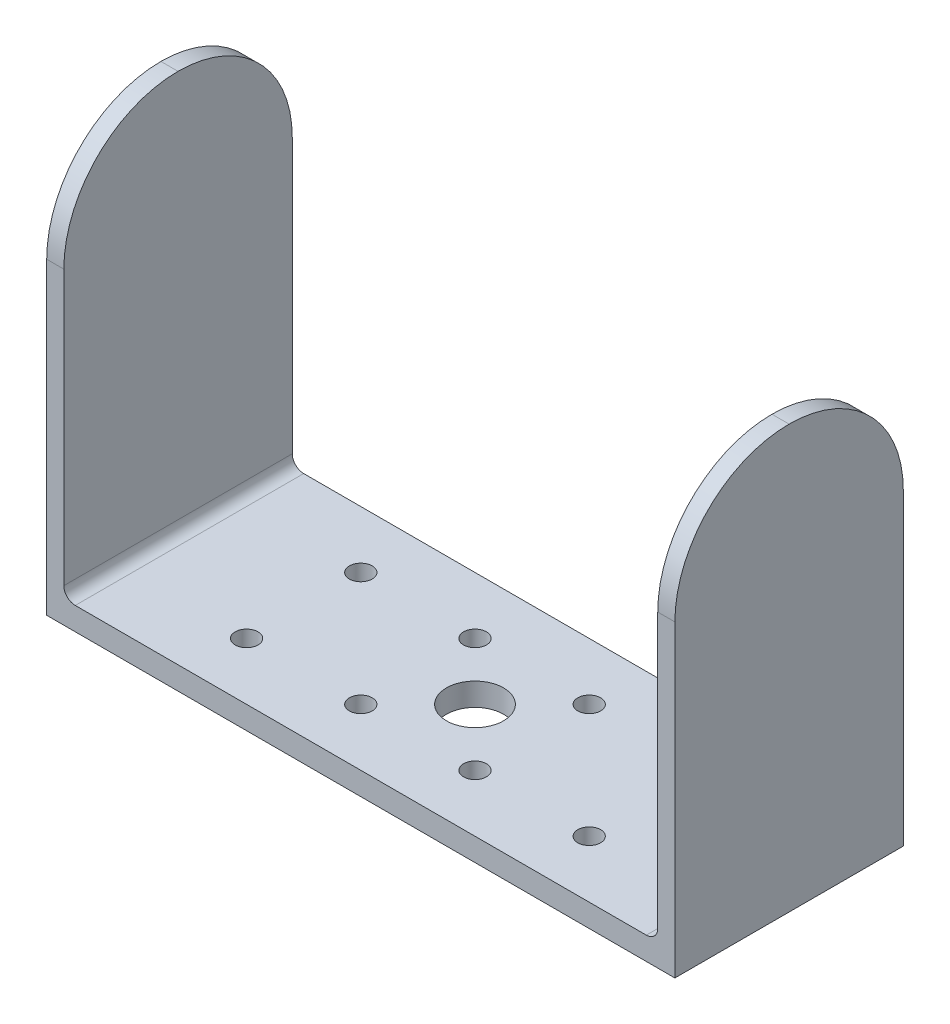
ISO-10303-21;
HEADER;
FILE_DESCRIPTION(('STEP AP214'),'2;1');
FILE_NAME('part.step','',(''),(''),'','','');
FILE_SCHEMA(('AUTOMOTIVE_DESIGN { 1 0 10303 214 1 1 1 1 }'));
ENDSEC;
DATA;
#1=APPLICATION_CONTEXT('core data for automotive mechanical design processes');
#2=APPLICATION_PROTOCOL_DEFINITION('international standard','automotive_design',2000,#1);
#3=PRODUCT_CONTEXT('',#1,'mechanical');
#4=PRODUCT('Part','Part','',(#3));
#5=PRODUCT_RELATED_PRODUCT_CATEGORY('part','',(#4));
#6=PRODUCT_DEFINITION_FORMATION('','',#4);
#7=PRODUCT_DEFINITION_CONTEXT('part definition',#1,'design');
#8=PRODUCT_DEFINITION('design','',#6,#7);
#9=PRODUCT_DEFINITION_SHAPE('','',#8);
#10=(LENGTH_UNIT() NAMED_UNIT(*) SI_UNIT(.MILLI.,.METRE.));
#11=(NAMED_UNIT(*) PLANE_ANGLE_UNIT() SI_UNIT($,.RADIAN.));
#12=(NAMED_UNIT(*) SI_UNIT($,.STERADIAN.) SOLID_ANGLE_UNIT());
#13=UNCERTAINTY_MEASURE_WITH_UNIT(LENGTH_MEASURE(1.E-05),#10,'distance_accuracy_value','');
#14=(GEOMETRIC_REPRESENTATION_CONTEXT(3) GLOBAL_UNCERTAINTY_ASSIGNED_CONTEXT((#13)) GLOBAL_UNIT_ASSIGNED_CONTEXT((#10,
#11,#12)) REPRESENTATION_CONTEXT('',''));
#15=CARTESIAN_POINT('',(0.,0.,0.));
#16=DIRECTION('',(0.,0.,1.));
#17=DIRECTION('',(1.,0.,0.));
#18=AXIS2_PLACEMENT_3D('',#15,#16,#17);
#19=CARTESIAN_POINT('',(0.,0.,0.));
#20=DIRECTION('',(0.,1.,0.));
#21=DIRECTION('',(0.,0.,1.));
#22=AXIS2_PLACEMENT_3D('',#19,#20,#21);
#23=PLANE('',#22);
#24=CARTESIAN_POINT('',(-5.,0.,-5.));
#25=DIRECTION('',(0.,1.,0.));
#26=DIRECTION('',(0.,0.,1.));
#27=AXIS2_PLACEMENT_3D('',#24,#25,#26);
#28=CIRCLE('',#27,1.);
#29=CARTESIAN_POINT('',(-5.,0.,-4.));
#30=VERTEX_POINT('',#29);
#31=EDGE_CURVE('E535',#30,#30,#28,.F.);
#32=ORIENTED_EDGE('',*,*,#31,.T.);
#33=EDGE_LOOP('',(#32));
#34=FACE_BOUND('',#33,.T.);
#35=CARTESIAN_POINT('',(5.,0.,-5.));
#36=DIRECTION('',(0.,1.,0.));
#37=DIRECTION('',(0.,0.,1.));
#38=AXIS2_PLACEMENT_3D('',#35,#36,#37);
#39=CIRCLE('',#38,1.);
#40=CARTESIAN_POINT('',(5.,0.,-4.));
#41=VERTEX_POINT('',#40);
#42=EDGE_CURVE('E539',#41,#41,#39,.F.);
#43=ORIENTED_EDGE('',*,*,#42,.T.);
#44=EDGE_LOOP('',(#43));
#45=FACE_BOUND('',#44,.T.);
#46=CARTESIAN_POINT('',(-5.,0.,5.));
#47=DIRECTION('',(0.,1.,0.));
#48=DIRECTION('',(0.,0.,1.));
#49=AXIS2_PLACEMENT_3D('',#46,#47,#48);
#50=CIRCLE('',#49,1.);
#51=CARTESIAN_POINT('',(-5.,0.,6.));
#52=VERTEX_POINT('',#51);
#53=EDGE_CURVE('E549',#52,#52,#50,.F.);
#54=ORIENTED_EDGE('',*,*,#53,.T.);
#55=EDGE_LOOP('',(#54));
#56=FACE_BOUND('',#55,.T.);
#57=CARTESIAN_POINT('',(5.,0.,5.));
#58=DIRECTION('',(0.,1.,0.));
#59=DIRECTION('',(0.,0.,1.));
#60=AXIS2_PLACEMENT_3D('',#57,#58,#59);
#61=CIRCLE('',#60,1.);
#62=CARTESIAN_POINT('',(5.,0.,6.));
#63=VERTEX_POINT('',#62);
#64=EDGE_CURVE('E555',#63,#63,#61,.F.);
#65=ORIENTED_EDGE('',*,*,#64,.T.);
#66=EDGE_LOOP('',(#65));
#67=FACE_BOUND('',#66,.T.);
#68=CARTESIAN_POINT('',(15.,0.,5.));
#69=DIRECTION('',(0.,1.,0.));
#70=DIRECTION('',(0.,0.,1.));
#71=AXIS2_PLACEMENT_3D('',#68,#69,#70);
#72=CIRCLE('',#71,1.);
#73=CARTESIAN_POINT('',(15.,0.,6.));
#74=VERTEX_POINT('',#73);
#75=EDGE_CURVE('E560',#74,#74,#72,.F.);
#76=ORIENTED_EDGE('',*,*,#75,.T.);
#77=EDGE_LOOP('',(#76));
#78=FACE_BOUND('',#77,.T.);
#79=CARTESIAN_POINT('',(-15.,0.,5.));
#80=DIRECTION('',(0.,1.,0.));
#81=DIRECTION('',(0.,0.,1.));
#82=AXIS2_PLACEMENT_3D('',#79,#80,#81);
#83=CIRCLE('',#82,0.999999999999996);
#84=CARTESIAN_POINT('',(-15.,0.,6.));
#85=VERTEX_POINT('',#84);
#86=EDGE_CURVE('E576',#85,#85,#83,.F.);
#87=ORIENTED_EDGE('',*,*,#86,.T.);
#88=EDGE_LOOP('',(#87));
#89=FACE_BOUND('',#88,.T.);
#90=CARTESIAN_POINT('',(15.,0.,-5.00000000000001));
#91=DIRECTION('',(0.,1.,0.));
#92=DIRECTION('',(0.,0.,1.));
#93=AXIS2_PLACEMENT_3D('',#90,#91,#92);
#94=CIRCLE('',#93,1.);
#95=CARTESIAN_POINT('',(15.,0.,-4.00000000000001));
#96=VERTEX_POINT('',#95);
#97=EDGE_CURVE('E584',#96,#96,#94,.F.);
#98=ORIENTED_EDGE('',*,*,#97,.T.);
#99=EDGE_LOOP('',(#98));
#100=FACE_BOUND('',#99,.T.);
#101=CARTESIAN_POINT('',(-15.,0.,-5.00000000000001));
#102=DIRECTION('',(0.,1.,0.));
#103=DIRECTION('',(0.,0.,1.));
#104=AXIS2_PLACEMENT_3D('',#101,#102,#103);
#105=CIRCLE('',#104,0.999999999999996);
#106=CARTESIAN_POINT('',(-15.,0.,-4.00000000000002));
#107=VERTEX_POINT('',#106);
#108=EDGE_CURVE('E590',#107,#107,#105,.F.);
#109=ORIENTED_EDGE('',*,*,#108,.T.);
#110=EDGE_LOOP('',(#109));
#111=FACE_BOUND('',#110,.T.);
#112=CARTESIAN_POINT('',(0.,0.,0.));
#113=DIRECTION('',(0.,1.,0.));
#114=DIRECTION('',(0.,0.,1.));
#115=AXIS2_PLACEMENT_3D('',#112,#113,#114);
#116=CIRCLE('',#115,2.5);
#117=CARTESIAN_POINT('',(0.,0.,2.49999999999999));
#118=VERTEX_POINT('',#117);
#119=EDGE_CURVE('E236',#118,#118,#116,.F.);
#120=ORIENTED_EDGE('',*,*,#119,.T.);
#121=EDGE_LOOP('',(#120));
#122=FACE_BOUND('',#121,.T.);
#123=DIRECTION('',(-1.,0.,0.));
#124=VECTOR('',#123,1.);
#125=CARTESIAN_POINT('',(-27.5,0.,-10.));
#126=LINE('',#125,#124);
#127=CARTESIAN_POINT('',(25.,0.,-10.));
#128=VERTEX_POINT('',#127);
#129=CARTESIAN_POINT('',(-25.,0.,-10.));
#130=VERTEX_POINT('',#129);
#131=EDGE_CURVE('E159',#128,#130,#126,.T.);
#132=ORIENTED_EDGE('',*,*,#131,.T.);
#133=DIRECTION('',(0.,0.,-1.));
#134=VECTOR('',#133,1.);
#135=CARTESIAN_POINT('',(-25.,0.,0.));
#136=LINE('',#135,#134);
#137=CARTESIAN_POINT('',(-25.,0.,10.));
#138=VERTEX_POINT('',#137);
#139=EDGE_CURVE('E212',#130,#138,#136,.F.);
#140=ORIENTED_EDGE('',*,*,#139,.T.);
#141=DIRECTION('',(1.,0.,0.));
#142=VECTOR('',#141,1.);
#143=CARTESIAN_POINT('',(-27.5,0.,10.));
#144=LINE('',#143,#142);
#145=CARTESIAN_POINT('',(25.,0.,10.));
#146=VERTEX_POINT('',#145);
#147=EDGE_CURVE('E156',#138,#146,#144,.T.);
#148=ORIENTED_EDGE('',*,*,#147,.T.);
#149=DIRECTION('',(0.,0.,1.));
#150=VECTOR('',#149,1.);
#151=CARTESIAN_POINT('',(25.,0.,0.));
#152=LINE('',#151,#150);
#153=EDGE_CURVE('E210',#146,#128,#152,.F.);
#154=ORIENTED_EDGE('',*,*,#153,.T.);
#155=EDGE_LOOP('',(#132,#140,#148,#154));
#156=FACE_BOUND('',#155,.T.);
#157=ADVANCED_FACE('F42',(#34,#45,#56,#67,#78,#89,#100,#111,#122,#156),#23,.T.);
#158=CARTESIAN_POINT('',(27.5,-2.,-10.));
#159=DIRECTION('',(1.,0.,0.));
#160=DIRECTION('',(0.,0.,-1.));
#161=AXIS2_PLACEMENT_3D('',#158,#159,#160);
#162=PLANE('',#161);
#163=CARTESIAN_POINT('',(27.5,25.,0.));
#164=DIRECTION('',(1.,0.,0.));
#165=DIRECTION('',(0.,0.,-1.));
#166=AXIS2_PLACEMENT_3D('',#163,#164,#165);
#167=CIRCLE('',#166,10.);
#168=CARTESIAN_POINT('',(27.5,25.,-10.));
#169=VERTEX_POINT('',#168);
#170=CARTESIAN_POINT('',(27.5,35.,0.));
#171=VERTEX_POINT('',#170);
#172=EDGE_CURVE('E191',#169,#171,#167,.T.);
#173=ORIENTED_EDGE('',*,*,#172,.T.);
#174=CARTESIAN_POINT('',(27.5,25.,0.));
#175=DIRECTION('',(1.,0.,0.));
#176=DIRECTION('',(0.,0.,-1.));
#177=AXIS2_PLACEMENT_3D('',#174,#175,#176);
#178=CIRCLE('',#177,10.);
#179=CARTESIAN_POINT('',(27.5,25.,10.));
#180=VERTEX_POINT('',#179);
#181=EDGE_CURVE('E193',#171,#180,#178,.T.);
#182=ORIENTED_EDGE('',*,*,#181,.T.);
#183=DIRECTION('',(0.,1.,0.));
#184=VECTOR('',#183,1.);
#185=CARTESIAN_POINT('',(27.5,-2.,10.));
#186=LINE('',#185,#184);
#187=CARTESIAN_POINT('',(27.5,-2.,10.));
#188=VERTEX_POINT('',#187);
#189=EDGE_CURVE('E155',#188,#180,#186,.T.);
#190=ORIENTED_EDGE('',*,*,#189,.F.);
#191=DIRECTION('',(0.,0.,-1.));
#192=VECTOR('',#191,1.);
#193=CARTESIAN_POINT('',(27.5,-2.,-10.));
#194=LINE('',#193,#192);
#195=CARTESIAN_POINT('',(27.5,-2.,-10.));
#196=VERTEX_POINT('',#195);
#197=EDGE_CURVE('E148',#188,#196,#194,.T.);
#198=ORIENTED_EDGE('',*,*,#197,.T.);
#199=DIRECTION('',(0.,1.,0.));
#200=VECTOR('',#199,1.);
#201=CARTESIAN_POINT('',(27.5,-2.,-10.));
#202=LINE('',#201,#200);
#203=EDGE_CURVE('E130',#196,#169,#202,.T.);
#204=ORIENTED_EDGE('',*,*,#203,.T.);
#205=EDGE_LOOP('',(#173,#182,#190,#198,#204));
#206=FACE_BOUND('',#205,.T.);
#207=ADVANCED_FACE('F153',(#206),#162,.T.);
#208=CARTESIAN_POINT('',(-27.5,-2.,10.));
#209=DIRECTION('',(0.,0.,1.));
#210=DIRECTION('',(1.,0.,0.));
#211=AXIS2_PLACEMENT_3D('',#208,#209,#210);
#212=PLANE('',#211);
#213=DIRECTION('',(0.,-1.,0.));
#214=VECTOR('',#213,1.);
#215=CARTESIAN_POINT('',(-26.,35.,10.));
#216=LINE('',#215,#214);
#217=CARTESIAN_POINT('',(-26.,25.,10.));
#218=VERTEX_POINT('',#217);
#219=CARTESIAN_POINT('',(-26.,1.,10.));
#220=VERTEX_POINT('',#219);
#221=EDGE_CURVE('E162',#218,#220,#216,.T.);
#222=ORIENTED_EDGE('',*,*,#221,.F.);
#223=DIRECTION('',(1.,0.,0.));
#224=VECTOR('',#223,1.);
#225=CARTESIAN_POINT('',(-27.5,25.,10.));
#226=LINE('',#225,#224);
#227=CARTESIAN_POINT('',(-27.5,25.,10.));
#228=VERTEX_POINT('',#227);
#229=EDGE_CURVE('E189',#218,#228,#226,.F.);
#230=ORIENTED_EDGE('',*,*,#229,.T.);
#231=DIRECTION('',(0.,1.,0.));
#232=VECTOR('',#231,1.);
#233=CARTESIAN_POINT('',(-27.5,-2.,10.));
#234=LINE('',#233,#232);
#235=CARTESIAN_POINT('',(-27.5,-2.,10.));
#236=VERTEX_POINT('',#235);
#237=EDGE_CURVE('E171',#236,#228,#234,.T.);
#238=ORIENTED_EDGE('',*,*,#237,.F.);
#239=DIRECTION('',(1.,0.,0.));
#240=VECTOR('',#239,1.);
#241=CARTESIAN_POINT('',(-27.5,-2.,10.));
#242=LINE('',#241,#240);
#243=EDGE_CURVE('E141',#236,#188,#242,.T.);
#244=ORIENTED_EDGE('',*,*,#243,.T.);
#245=ORIENTED_EDGE('',*,*,#189,.T.);
#246=DIRECTION('',(1.,0.,0.));
#247=VECTOR('',#246,1.);
#248=CARTESIAN_POINT('',(26.,25.,10.));
#249=LINE('',#248,#247);
#250=CARTESIAN_POINT('',(26.,25.,10.));
#251=VERTEX_POINT('',#250);
#252=EDGE_CURVE('E186',#180,#251,#249,.F.);
#253=ORIENTED_EDGE('',*,*,#252,.T.);
#254=DIRECTION('',(0.,-1.,0.));
#255=VECTOR('',#254,1.);
#256=CARTESIAN_POINT('',(26.,35.,10.));
#257=LINE('',#256,#255);
#258=CARTESIAN_POINT('',(26.,1.,10.));
#259=VERTEX_POINT('',#258);
#260=EDGE_CURVE('E226',#251,#259,#257,.T.);
#261=ORIENTED_EDGE('',*,*,#260,.T.);
#262=CARTESIAN_POINT('',(25.,1.,10.));
#263=DIRECTION('',(0.,0.,1.));
#264=DIRECTION('',(1.,0.,0.));
#265=AXIS2_PLACEMENT_3D('',#262,#263,#264);
#266=CIRCLE('',#265,1.);
#267=EDGE_CURVE('E50',#259,#146,#266,.F.);
#268=ORIENTED_EDGE('',*,*,#267,.T.);
#269=ORIENTED_EDGE('',*,*,#147,.F.);
#270=CARTESIAN_POINT('',(-25.,1.,10.));
#271=DIRECTION('',(0.,0.,1.));
#272=DIRECTION('',(1.,0.,0.));
#273=AXIS2_PLACEMENT_3D('',#270,#271,#272);
#274=CIRCLE('',#273,1.);
#275=EDGE_CURVE('E218',#138,#220,#274,.F.);
#276=ORIENTED_EDGE('',*,*,#275,.T.);
#277=EDGE_LOOP('',(#222,#230,#238,#244,#245,#253,#261,#268,#269,#276));
#278=FACE_BOUND('',#277,.T.);
#279=ADVANCED_FACE('F223',(#278),#212,.T.);
#280=CARTESIAN_POINT('',(-27.5,-2.,-10.));
#281=DIRECTION('',(-1.,0.,0.));
#282=DIRECTION('',(0.,0.,1.));
#283=AXIS2_PLACEMENT_3D('',#280,#281,#282);
#284=PLANE('',#283);
#285=CARTESIAN_POINT('',(-27.5,25.,0.));
#286=DIRECTION('',(-1.,0.,0.));
#287=DIRECTION('',(0.,0.,1.));
#288=AXIS2_PLACEMENT_3D('',#285,#286,#287);
#289=CIRCLE('',#288,10.);
#290=CARTESIAN_POINT('',(-27.5,35.,0.));
#291=VERTEX_POINT('',#290);
#292=EDGE_CURVE('E170',#228,#291,#289,.T.);
#293=ORIENTED_EDGE('',*,*,#292,.T.);
#294=CARTESIAN_POINT('',(-27.5,25.,0.));
#295=DIRECTION('',(-1.,0.,0.));
#296=DIRECTION('',(0.,0.,1.));
#297=AXIS2_PLACEMENT_3D('',#294,#295,#296);
#298=CIRCLE('',#297,10.);
#299=CARTESIAN_POINT('',(-27.5,25.,-10.));
#300=VERTEX_POINT('',#299);
#301=EDGE_CURVE('E176',#291,#300,#298,.T.);
#302=ORIENTED_EDGE('',*,*,#301,.T.);
#303=DIRECTION('',(0.,1.,0.));
#304=VECTOR('',#303,1.);
#305=CARTESIAN_POINT('',(-27.5,-2.,-10.));
#306=LINE('',#305,#304);
#307=CARTESIAN_POINT('',(-27.5,-2.,-10.));
#308=VERTEX_POINT('',#307);
#309=EDGE_CURVE('E140',#308,#300,#306,.T.);
#310=ORIENTED_EDGE('',*,*,#309,.F.);
#311=DIRECTION('',(0.,0.,1.));
#312=VECTOR('',#311,1.);
#313=CARTESIAN_POINT('',(-27.5,-2.,-10.));
#314=LINE('',#313,#312);
#315=EDGE_CURVE('E151',#308,#236,#314,.T.);
#316=ORIENTED_EDGE('',*,*,#315,.T.);
#317=ORIENTED_EDGE('',*,*,#237,.T.);
#318=EDGE_LOOP('',(#293,#302,#310,#316,#317));
#319=FACE_BOUND('',#318,.T.);
#320=ADVANCED_FACE('F273',(#319),#284,.T.);
#321=CARTESIAN_POINT('',(-27.5,-2.,-10.));
#322=DIRECTION('',(0.,0.,-1.));
#323=DIRECTION('',(-1.,0.,0.));
#324=AXIS2_PLACEMENT_3D('',#321,#322,#323);
#325=PLANE('',#324);
#326=ORIENTED_EDGE('',*,*,#309,.T.);
#327=DIRECTION('',(-1.,0.,0.));
#328=VECTOR('',#327,1.);
#329=CARTESIAN_POINT('',(-27.5,25.,-10.));
#330=LINE('',#329,#328);
#331=CARTESIAN_POINT('',(-26.,25.,-10.));
#332=VERTEX_POINT('',#331);
#333=EDGE_CURVE('E179',#300,#332,#330,.F.);
#334=ORIENTED_EDGE('',*,*,#333,.T.);
#335=DIRECTION('',(0.,-1.,0.));
#336=VECTOR('',#335,1.);
#337=CARTESIAN_POINT('',(-26.,35.,-10.));
#338=LINE('',#337,#336);
#339=CARTESIAN_POINT('',(-26.,1.,-10.));
#340=VERTEX_POINT('',#339);
#341=EDGE_CURVE('E233',#332,#340,#338,.T.);
#342=ORIENTED_EDGE('',*,*,#341,.T.);
#343=CARTESIAN_POINT('',(-25.,1.,-10.));
#344=DIRECTION('',(0.,0.,-1.));
#345=DIRECTION('',(-1.,0.,0.));
#346=AXIS2_PLACEMENT_3D('',#343,#344,#345);
#347=CIRCLE('',#346,1.);
#348=EDGE_CURVE('E216',#340,#130,#347,.F.);
#349=ORIENTED_EDGE('',*,*,#348,.T.);
#350=ORIENTED_EDGE('',*,*,#131,.F.);
#351=CARTESIAN_POINT('',(25.,1.,-10.));
#352=DIRECTION('',(0.,0.,-1.));
#353=DIRECTION('',(-1.,0.,0.));
#354=AXIS2_PLACEMENT_3D('',#351,#352,#353);
#355=CIRCLE('',#354,1.);
#356=CARTESIAN_POINT('',(26.,1.,-10.));
#357=VERTEX_POINT('',#356);
#358=EDGE_CURVE('E11',#128,#357,#355,.F.);
#359=ORIENTED_EDGE('',*,*,#358,.T.);
#360=DIRECTION('',(0.,-1.,0.));
#361=VECTOR('',#360,1.);
#362=CARTESIAN_POINT('',(26.,35.,-10.));
#363=LINE('',#362,#361);
#364=CARTESIAN_POINT('',(26.,25.,-10.));
#365=VERTEX_POINT('',#364);
#366=EDGE_CURVE('E203',#365,#357,#363,.T.);
#367=ORIENTED_EDGE('',*,*,#366,.F.);
#368=DIRECTION('',(-1.,0.,0.));
#369=VECTOR('',#368,1.);
#370=CARTESIAN_POINT('',(27.5,25.,-10.));
#371=LINE('',#370,#369);
#372=EDGE_CURVE('E136',#365,#169,#371,.F.);
#373=ORIENTED_EDGE('',*,*,#372,.T.);
#374=ORIENTED_EDGE('',*,*,#203,.F.);
#375=DIRECTION('',(-1.,0.,0.));
#376=VECTOR('',#375,1.);
#377=CARTESIAN_POINT('',(-27.5,-2.,-10.));
#378=LINE('',#377,#376);
#379=EDGE_CURVE('E134',#196,#308,#378,.T.);
#380=ORIENTED_EDGE('',*,*,#379,.T.);
#381=EDGE_LOOP('',(#326,#334,#342,#349,#350,#359,#367,#373,#374,#380));
#382=FACE_BOUND('',#381,.T.);
#383=ADVANCED_FACE('F133',(#382),#325,.T.);
#384=CARTESIAN_POINT('',(0.,-2.,0.));
#385=DIRECTION('',(0.,1.,0.));
#386=DIRECTION('',(0.,0.,1.));
#387=AXIS2_PLACEMENT_3D('',#384,#385,#386);
#388=PLANE('',#387);
#389=CARTESIAN_POINT('',(-5.,-2.,-5.));
#390=DIRECTION('',(0.,-1.,0.));
#391=DIRECTION('',(0.,0.,-1.));
#392=AXIS2_PLACEMENT_3D('',#389,#390,#391);
#393=CIRCLE('',#392,1.);
#394=CARTESIAN_POINT('',(-5.,-2.,-6.));
#395=VERTEX_POINT('',#394);
#396=EDGE_CURVE('E538',#395,#395,#393,.T.);
#397=ORIENTED_EDGE('',*,*,#396,.F.);
#398=EDGE_LOOP('',(#397));
#399=FACE_BOUND('',#398,.T.);
#400=CARTESIAN_POINT('',(5.,-2.,-5.));
#401=DIRECTION('',(0.,-1.,0.));
#402=DIRECTION('',(0.,0.,-1.));
#403=AXIS2_PLACEMENT_3D('',#400,#401,#402);
#404=CIRCLE('',#403,1.);
#405=CARTESIAN_POINT('',(5.,-2.,-6.));
#406=VERTEX_POINT('',#405);
#407=EDGE_CURVE('E543',#406,#406,#404,.T.);
#408=ORIENTED_EDGE('',*,*,#407,.F.);
#409=EDGE_LOOP('',(#408));
#410=FACE_BOUND('',#409,.T.);
#411=CARTESIAN_POINT('',(-5.,-2.,5.));
#412=DIRECTION('',(0.,-1.,0.));
#413=DIRECTION('',(0.,0.,-1.));
#414=AXIS2_PLACEMENT_3D('',#411,#412,#413);
#415=CIRCLE('',#414,1.);
#416=CARTESIAN_POINT('',(-5.,-2.,4.));
#417=VERTEX_POINT('',#416);
#418=EDGE_CURVE('E552',#417,#417,#415,.T.);
#419=ORIENTED_EDGE('',*,*,#418,.F.);
#420=EDGE_LOOP('',(#419));
#421=FACE_BOUND('',#420,.T.);
#422=CARTESIAN_POINT('',(5.,-2.,5.));
#423=DIRECTION('',(0.,-1.,0.));
#424=DIRECTION('',(0.,0.,-1.));
#425=AXIS2_PLACEMENT_3D('',#422,#423,#424);
#426=CIRCLE('',#425,1.);
#427=CARTESIAN_POINT('',(5.,-2.,4.));
#428=VERTEX_POINT('',#427);
#429=EDGE_CURVE('E558',#428,#428,#426,.T.);
#430=ORIENTED_EDGE('',*,*,#429,.F.);
#431=EDGE_LOOP('',(#430));
#432=FACE_BOUND('',#431,.T.);
#433=CARTESIAN_POINT('',(15.,-2.,5.));
#434=DIRECTION('',(0.,-1.,0.));
#435=DIRECTION('',(0.,0.,-1.));
#436=AXIS2_PLACEMENT_3D('',#433,#434,#435);
#437=CIRCLE('',#436,1.);
#438=CARTESIAN_POINT('',(15.,-2.,4.));
#439=VERTEX_POINT('',#438);
#440=EDGE_CURVE('E571',#439,#439,#437,.T.);
#441=ORIENTED_EDGE('',*,*,#440,.F.);
#442=EDGE_LOOP('',(#441));
#443=FACE_BOUND('',#442,.T.);
#444=CARTESIAN_POINT('',(-15.,-2.,5.));
#445=DIRECTION('',(0.,-1.,0.));
#446=DIRECTION('',(0.,0.,1.));
#447=AXIS2_PLACEMENT_3D('',#444,#445,#446);
#448=CIRCLE('',#447,0.999999999999996);
#449=CARTESIAN_POINT('',(-15.,-2.,6.));
#450=VERTEX_POINT('',#449);
#451=EDGE_CURVE('E581',#450,#450,#448,.T.);
#452=ORIENTED_EDGE('',*,*,#451,.F.);
#453=EDGE_LOOP('',(#452));
#454=FACE_BOUND('',#453,.T.);
#455=CARTESIAN_POINT('',(15.,-2.,-5.00000000000001));
#456=DIRECTION('',(0.,-1.,0.));
#457=DIRECTION('',(0.,0.,1.));
#458=AXIS2_PLACEMENT_3D('',#455,#456,#457);
#459=CIRCLE('',#458,1.);
#460=CARTESIAN_POINT('',(15.,-2.,-4.00000000000001));
#461=VERTEX_POINT('',#460);
#462=EDGE_CURVE('E587',#461,#461,#459,.T.);
#463=ORIENTED_EDGE('',*,*,#462,.F.);
#464=EDGE_LOOP('',(#463));
#465=FACE_BOUND('',#464,.T.);
#466=CARTESIAN_POINT('',(-15.,-2.,-5.00000000000001));
#467=DIRECTION('',(0.,-1.,0.));
#468=DIRECTION('',(0.,0.,-1.));
#469=AXIS2_PLACEMENT_3D('',#466,#467,#468);
#470=CIRCLE('',#469,0.999999999999996);
#471=CARTESIAN_POINT('',(-15.,-2.,-6.00000000000001));
#472=VERTEX_POINT('',#471);
#473=EDGE_CURVE('E592',#472,#472,#470,.T.);
#474=ORIENTED_EDGE('',*,*,#473,.F.);
#475=EDGE_LOOP('',(#474));
#476=FACE_BOUND('',#475,.T.);
#477=CARTESIAN_POINT('',(0.,-2.,0.));
#478=DIRECTION('',(0.,-1.,0.));
#479=DIRECTION('',(0.,0.,-1.));
#480=AXIS2_PLACEMENT_3D('',#477,#478,#479);
#481=CIRCLE('',#480,2.5);
#482=CARTESIAN_POINT('',(0.,-2.,-2.50000000000001));
#483=VERTEX_POINT('',#482);
#484=EDGE_CURVE('E207',#483,#483,#481,.T.);
#485=ORIENTED_EDGE('',*,*,#484,.F.);
#486=EDGE_LOOP('',(#485));
#487=FACE_BOUND('',#486,.T.);
#488=ORIENTED_EDGE('',*,*,#197,.F.);
#489=ORIENTED_EDGE('',*,*,#243,.F.);
#490=ORIENTED_EDGE('',*,*,#315,.F.);
#491=ORIENTED_EDGE('',*,*,#379,.F.);
#492=EDGE_LOOP('',(#488,#489,#490,#491));
#493=FACE_BOUND('',#492,.T.);
#494=ADVANCED_FACE('F146',(#399,#410,#421,#432,#443,#454,#465,#476,#487,#493),#388,.F.);
#495=CARTESIAN_POINT('',(-26.,35.,-10.));
#496=DIRECTION('',(-1.,0.,0.));
#497=DIRECTION('',(0.,0.,1.));
#498=AXIS2_PLACEMENT_3D('',#495,#496,#497);
#499=PLANE('',#498);
#500=ORIENTED_EDGE('',*,*,#221,.T.);
#501=DIRECTION('',(0.,0.,-1.));
#502=VECTOR('',#501,1.);
#503=CARTESIAN_POINT('',(-26.,1.,-10.));
#504=LINE('',#503,#502);
#505=EDGE_CURVE('E199',#220,#340,#504,.T.);
#506=ORIENTED_EDGE('',*,*,#505,.T.);
#507=ORIENTED_EDGE('',*,*,#341,.F.);
#508=CARTESIAN_POINT('',(-26.,25.,0.));
#509=DIRECTION('',(-1.,0.,0.));
#510=DIRECTION('',(0.,0.,1.));
#511=AXIS2_PLACEMENT_3D('',#508,#509,#510);
#512=CIRCLE('',#511,10.);
#513=CARTESIAN_POINT('',(-26.,35.,0.));
#514=VERTEX_POINT('',#513);
#515=EDGE_CURVE('E184',#332,#514,#512,.F.);
#516=ORIENTED_EDGE('',*,*,#515,.T.);
#517=CARTESIAN_POINT('',(-26.,25.,0.));
#518=DIRECTION('',(-1.,0.,0.));
#519=DIRECTION('',(0.,0.,1.));
#520=AXIS2_PLACEMENT_3D('',#517,#518,#519);
#521=CIRCLE('',#520,10.);
#522=EDGE_CURVE('E182',#514,#218,#521,.F.);
#523=ORIENTED_EDGE('',*,*,#522,.T.);
#524=EDGE_LOOP('',(#500,#506,#507,#516,#523));
#525=FACE_BOUND('',#524,.T.);
#526=ADVANCED_FACE('F243',(#525),#499,.F.);
#527=CARTESIAN_POINT('',(26.,35.,-10.));
#528=DIRECTION('',(1.,0.,0.));
#529=DIRECTION('',(0.,0.,-1.));
#530=AXIS2_PLACEMENT_3D('',#527,#528,#529);
#531=PLANE('',#530);
#532=ORIENTED_EDGE('',*,*,#366,.T.);
#533=DIRECTION('',(0.,0.,1.));
#534=VECTOR('',#533,1.);
#535=CARTESIAN_POINT('',(26.,1.,-10.));
#536=LINE('',#535,#534);
#537=EDGE_CURVE('E214',#357,#259,#536,.T.);
#538=ORIENTED_EDGE('',*,*,#537,.T.);
#539=ORIENTED_EDGE('',*,*,#260,.F.);
#540=CARTESIAN_POINT('',(26.,25.,0.));
#541=DIRECTION('',(1.,0.,0.));
#542=DIRECTION('',(0.,0.,-1.));
#543=AXIS2_PLACEMENT_3D('',#540,#541,#542);
#544=CIRCLE('',#543,10.);
#545=CARTESIAN_POINT('',(26.,35.,0.));
#546=VERTEX_POINT('',#545);
#547=EDGE_CURVE('E197',#251,#546,#544,.F.);
#548=ORIENTED_EDGE('',*,*,#547,.T.);
#549=CARTESIAN_POINT('',(26.,25.,0.));
#550=DIRECTION('',(1.,0.,0.));
#551=DIRECTION('',(0.,0.,-1.));
#552=AXIS2_PLACEMENT_3D('',#549,#550,#551);
#553=CIRCLE('',#552,10.);
#554=EDGE_CURVE('E195',#546,#365,#553,.F.);
#555=ORIENTED_EDGE('',*,*,#554,.T.);
#556=EDGE_LOOP('',(#532,#538,#539,#548,#555));
#557=FACE_BOUND('',#556,.T.);
#558=ADVANCED_FACE('F230',(#557),#531,.F.);
#559=CARTESIAN_POINT('',(0.,25.,0.));
#560=DIRECTION('',(1.,0.,0.));
#561=DIRECTION('',(0.,0.,-1.));
#562=AXIS2_PLACEMENT_3D('',#559,#560,#561);
#563=CYLINDRICAL_SURFACE('',#562,10.);
#564=ORIENTED_EDGE('',*,*,#229,.F.);
#565=ORIENTED_EDGE('',*,*,#522,.F.);
#566=DIRECTION('',(1.,0.,0.));
#567=VECTOR('',#566,1.);
#568=CARTESIAN_POINT('',(0.,35.,0.));
#569=LINE('',#568,#567);
#570=EDGE_CURVE('E200',#291,#514,#569,.T.);
#571=ORIENTED_EDGE('',*,*,#570,.F.);
#572=ORIENTED_EDGE('',*,*,#292,.F.);
#573=EDGE_LOOP('',(#564,#565,#571,#572));
#574=FACE_BOUND('',#573,.T.);
#575=ADVANCED_FACE('F282',(#574),#563,.T.);
#576=CARTESIAN_POINT('',(0.,25.,0.));
#577=DIRECTION('',(-1.,0.,0.));
#578=DIRECTION('',(0.,0.,1.));
#579=AXIS2_PLACEMENT_3D('',#576,#577,#578);
#580=CYLINDRICAL_SURFACE('',#579,10.);
#581=ORIENTED_EDGE('',*,*,#515,.F.);
#582=ORIENTED_EDGE('',*,*,#333,.F.);
#583=ORIENTED_EDGE('',*,*,#301,.F.);
#584=ORIENTED_EDGE('',*,*,#570,.T.);
#585=EDGE_LOOP('',(#581,#582,#583,#584));
#586=FACE_BOUND('',#585,.T.);
#587=ADVANCED_FACE('F279',(#586),#580,.T.);
#588=CARTESIAN_POINT('',(0.,25.,0.));
#589=DIRECTION('',(1.,0.,0.));
#590=DIRECTION('',(0.,0.,-1.));
#591=AXIS2_PLACEMENT_3D('',#588,#589,#590);
#592=CYLINDRICAL_SURFACE('',#591,10.);
#593=ORIENTED_EDGE('',*,*,#372,.F.);
#594=ORIENTED_EDGE('',*,*,#554,.F.);
#595=DIRECTION('',(-1.,0.,0.));
#596=VECTOR('',#595,1.);
#597=CARTESIAN_POINT('',(26.,35.,0.));
#598=LINE('',#597,#596);
#599=EDGE_CURVE('E204',#171,#546,#598,.T.);
#600=ORIENTED_EDGE('',*,*,#599,.F.);
#601=ORIENTED_EDGE('',*,*,#172,.F.);
#602=EDGE_LOOP('',(#593,#594,#600,#601));
#603=FACE_BOUND('',#602,.T.);
#604=ADVANCED_FACE('F255',(#603),#592,.T.);
#605=CARTESIAN_POINT('',(0.,25.,0.));
#606=DIRECTION('',(-1.,0.,0.));
#607=DIRECTION('',(0.,0.,1.));
#608=AXIS2_PLACEMENT_3D('',#605,#606,#607);
#609=CYLINDRICAL_SURFACE('',#608,10.);
#610=ORIENTED_EDGE('',*,*,#547,.F.);
#611=ORIENTED_EDGE('',*,*,#252,.F.);
#612=ORIENTED_EDGE('',*,*,#181,.F.);
#613=ORIENTED_EDGE('',*,*,#599,.T.);
#614=EDGE_LOOP('',(#610,#611,#612,#613));
#615=FACE_BOUND('',#614,.T.);
#616=ADVANCED_FACE('F249',(#615),#609,.T.);
#617=CARTESIAN_POINT('',(-25.,1.,-10.));
#618=DIRECTION('',(0.,0.,-1.));
#619=DIRECTION('',(-1.,0.,0.));
#620=AXIS2_PLACEMENT_3D('',#617,#618,#619);
#621=CYLINDRICAL_SURFACE('',#620,1.);
#622=ORIENTED_EDGE('',*,*,#275,.F.);
#623=ORIENTED_EDGE('',*,*,#139,.F.);
#624=ORIENTED_EDGE('',*,*,#348,.F.);
#625=ORIENTED_EDGE('',*,*,#505,.F.);
#626=EDGE_LOOP('',(#622,#623,#624,#625));
#627=FACE_BOUND('',#626,.T.);
#628=ADVANCED_FACE('F247',(#627),#621,.F.);
#629=CARTESIAN_POINT('',(25.,1.,-10.));
#630=DIRECTION('',(0.,0.,1.));
#631=DIRECTION('',(1.,0.,0.));
#632=AXIS2_PLACEMENT_3D('',#629,#630,#631);
#633=CYLINDRICAL_SURFACE('',#632,1.);
#634=ORIENTED_EDGE('',*,*,#358,.F.);
#635=ORIENTED_EDGE('',*,*,#153,.F.);
#636=ORIENTED_EDGE('',*,*,#267,.F.);
#637=ORIENTED_EDGE('',*,*,#537,.F.);
#638=EDGE_LOOP('',(#634,#635,#636,#637));
#639=FACE_BOUND('',#638,.T.);
#640=ADVANCED_FACE('F44',(#639),#633,.F.);
#641=CARTESIAN_POINT('',(0.,35.001,0.));
#642=DIRECTION('',(0.,-1.,0.));
#643=DIRECTION('',(0.,0.,-1.));
#644=AXIS2_PLACEMENT_3D('',#641,#642,#643);
#645=CYLINDRICAL_SURFACE('',#644,2.5);
#646=ORIENTED_EDGE('',*,*,#119,.F.);
#647=EDGE_LOOP('',(#646));
#648=FACE_BOUND('',#647,.T.);
#649=ORIENTED_EDGE('',*,*,#484,.T.);
#650=EDGE_LOOP('',(#649));
#651=FACE_BOUND('',#650,.T.);
#652=ADVANCED_FACE('F254',(#648,#651),#645,.F.);
#653=CARTESIAN_POINT('',(-15.,35.001,-5.00000000000001));
#654=DIRECTION('',(0.,-1.,0.));
#655=DIRECTION('',(0.,0.,-1.));
#656=AXIS2_PLACEMENT_3D('',#653,#654,#655);
#657=CYLINDRICAL_SURFACE('',#656,0.999999999999996);
#658=ORIENTED_EDGE('',*,*,#108,.F.);
#659=EDGE_LOOP('',(#658));
#660=FACE_BOUND('',#659,.T.);
#661=ORIENTED_EDGE('',*,*,#473,.T.);
#662=EDGE_LOOP('',(#661));
#663=FACE_BOUND('',#662,.T.);
#664=ADVANCED_FACE('F372',(#660,#663),#657,.F.);
#665=CARTESIAN_POINT('',(15.,35.001,-5.00000000000001));
#666=DIRECTION('',(0.,-1.,0.));
#667=DIRECTION('',(0.,0.,-1.));
#668=AXIS2_PLACEMENT_3D('',#665,#666,#667);
#669=CYLINDRICAL_SURFACE('',#668,1.);
#670=ORIENTED_EDGE('',*,*,#97,.F.);
#671=EDGE_LOOP('',(#670));
#672=FACE_BOUND('',#671,.T.);
#673=ORIENTED_EDGE('',*,*,#462,.T.);
#674=EDGE_LOOP('',(#673));
#675=FACE_BOUND('',#674,.T.);
#676=ADVANCED_FACE('F383',(#672,#675),#669,.F.);
#677=CARTESIAN_POINT('',(-15.,35.001,5.));
#678=DIRECTION('',(0.,-1.,0.));
#679=DIRECTION('',(0.,0.,-1.));
#680=AXIS2_PLACEMENT_3D('',#677,#678,#679);
#681=CYLINDRICAL_SURFACE('',#680,0.999999999999996);
#682=ORIENTED_EDGE('',*,*,#86,.F.);
#683=EDGE_LOOP('',(#682));
#684=FACE_BOUND('',#683,.T.);
#685=ORIENTED_EDGE('',*,*,#451,.T.);
#686=EDGE_LOOP('',(#685));
#687=FACE_BOUND('',#686,.T.);
#688=ADVANCED_FACE('F394',(#684,#687),#681,.F.);
#689=CARTESIAN_POINT('',(15.,35.001,5.));
#690=DIRECTION('',(0.,-1.,0.));
#691=DIRECTION('',(0.,0.,-1.));
#692=AXIS2_PLACEMENT_3D('',#689,#690,#691);
#693=CYLINDRICAL_SURFACE('',#692,1.);
#694=ORIENTED_EDGE('',*,*,#75,.F.);
#695=EDGE_LOOP('',(#694));
#696=FACE_BOUND('',#695,.T.);
#697=ORIENTED_EDGE('',*,*,#440,.T.);
#698=EDGE_LOOP('',(#697));
#699=FACE_BOUND('',#698,.T.);
#700=ADVANCED_FACE('F405',(#696,#699),#693,.F.);
#701=CARTESIAN_POINT('',(5.,35.001,5.));
#702=DIRECTION('',(0.,-1.,0.));
#703=DIRECTION('',(0.,0.,-1.));
#704=AXIS2_PLACEMENT_3D('',#701,#702,#703);
#705=CYLINDRICAL_SURFACE('',#704,1.);
#706=ORIENTED_EDGE('',*,*,#64,.F.);
#707=EDGE_LOOP('',(#706));
#708=FACE_BOUND('',#707,.T.);
#709=ORIENTED_EDGE('',*,*,#429,.T.);
#710=EDGE_LOOP('',(#709));
#711=FACE_BOUND('',#710,.T.);
#712=ADVANCED_FACE('F416',(#708,#711),#705,.F.);
#713=CARTESIAN_POINT('',(-5.,35.001,5.));
#714=DIRECTION('',(0.,-1.,0.));
#715=DIRECTION('',(0.,0.,-1.));
#716=AXIS2_PLACEMENT_3D('',#713,#714,#715);
#717=CYLINDRICAL_SURFACE('',#716,1.);
#718=ORIENTED_EDGE('',*,*,#53,.F.);
#719=EDGE_LOOP('',(#718));
#720=FACE_BOUND('',#719,.T.);
#721=ORIENTED_EDGE('',*,*,#418,.T.);
#722=EDGE_LOOP('',(#721));
#723=FACE_BOUND('',#722,.T.);
#724=ADVANCED_FACE('F427',(#720,#723),#717,.F.);
#725=CARTESIAN_POINT('',(5.,35.001,-5.));
#726=DIRECTION('',(0.,-1.,0.));
#727=DIRECTION('',(0.,0.,-1.));
#728=AXIS2_PLACEMENT_3D('',#725,#726,#727);
#729=CYLINDRICAL_SURFACE('',#728,1.);
#730=ORIENTED_EDGE('',*,*,#42,.F.);
#731=EDGE_LOOP('',(#730));
#732=FACE_BOUND('',#731,.T.);
#733=ORIENTED_EDGE('',*,*,#407,.T.);
#734=EDGE_LOOP('',(#733));
#735=FACE_BOUND('',#734,.T.);
#736=ADVANCED_FACE('F438',(#732,#735),#729,.F.);
#737=CARTESIAN_POINT('',(-5.,35.001,-5.));
#738=DIRECTION('',(0.,-1.,0.));
#739=DIRECTION('',(0.,0.,-1.));
#740=AXIS2_PLACEMENT_3D('',#737,#738,#739);
#741=CYLINDRICAL_SURFACE('',#740,1.);
#742=ORIENTED_EDGE('',*,*,#31,.F.);
#743=EDGE_LOOP('',(#742));
#744=FACE_BOUND('',#743,.T.);
#745=ORIENTED_EDGE('',*,*,#396,.T.);
#746=EDGE_LOOP('',(#745));
#747=FACE_BOUND('',#746,.T.);
#748=ADVANCED_FACE('F449',(#744,#747),#741,.F.);
#749=CLOSED_SHELL('',(#157,#207,#279,#320,#383,#494,#526,#558,#575,#587,#604,#616,#628,#640,
#652,#664,#676,#688,#700,#712,#724,#736,#748));
#750=MANIFOLD_SOLID_BREP('B2',#749);
#751=ADVANCED_BREP_SHAPE_REPRESENTATION('',(#18,#750),#14);
#752=SHAPE_DEFINITION_REPRESENTATION(#9,#751);
ENDSEC;
END-ISO-10303-21;
